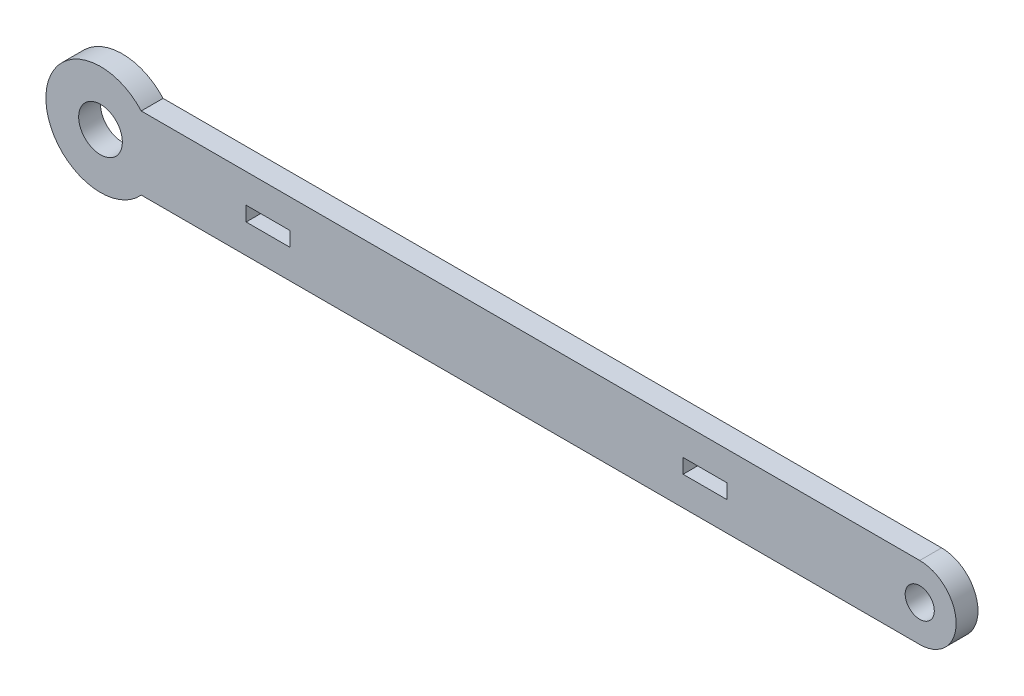
ISO-10303-21;
HEADER;
FILE_DESCRIPTION(('STEP AP214'),'2;1');
FILE_NAME('part.step','',(''),(''),'','','');
FILE_SCHEMA(('AUTOMOTIVE_DESIGN { 1 0 10303 214 1 1 1 1 }'));
ENDSEC;
DATA;
#1=APPLICATION_CONTEXT('core data for automotive mechanical design processes');
#2=APPLICATION_PROTOCOL_DEFINITION('international standard','automotive_design',2000,#1);
#3=PRODUCT_CONTEXT('',#1,'mechanical');
#4=PRODUCT('Part','Part','',(#3));
#5=PRODUCT_RELATED_PRODUCT_CATEGORY('part','',(#4));
#6=PRODUCT_DEFINITION_FORMATION('','',#4);
#7=PRODUCT_DEFINITION_CONTEXT('part definition',#1,'design');
#8=PRODUCT_DEFINITION('design','',#6,#7);
#9=PRODUCT_DEFINITION_SHAPE('','',#8);
#10=(LENGTH_UNIT() NAMED_UNIT(*) SI_UNIT(.MILLI.,.METRE.));
#11=(NAMED_UNIT(*) PLANE_ANGLE_UNIT() SI_UNIT($,.RADIAN.));
#12=(NAMED_UNIT(*) SI_UNIT($,.STERADIAN.) SOLID_ANGLE_UNIT());
#13=UNCERTAINTY_MEASURE_WITH_UNIT(LENGTH_MEASURE(1.E-05),#10,'distance_accuracy_value','');
#14=(GEOMETRIC_REPRESENTATION_CONTEXT(3) GLOBAL_UNCERTAINTY_ASSIGNED_CONTEXT((#13)) GLOBAL_UNIT_ASSIGNED_CONTEXT((#10,
#11,#12)) REPRESENTATION_CONTEXT('',''));
#15=CARTESIAN_POINT('',(0.,0.,0.));
#16=DIRECTION('',(0.,0.,1.));
#17=DIRECTION('',(1.,0.,0.));
#18=AXIS2_PLACEMENT_3D('',#15,#16,#17);
#19=CARTESIAN_POINT('',(0.,0.,1.5));
#20=DIRECTION('',(0.,0.,1.));
#21=DIRECTION('',(1.,0.,0.));
#22=AXIS2_PLACEMENT_3D('',#19,#20,#21);
#23=PLANE('',#22);
#24=CARTESIAN_POINT('',(112.5,0.,1.5));
#25=DIRECTION('',(0.,0.,1.));
#26=DIRECTION('',(1.,0.,0.));
#27=AXIS2_PLACEMENT_3D('',#24,#25,#26);
#28=CIRCLE('',#27,2.);
#29=CARTESIAN_POINT('',(114.5,0.,1.5));
#30=VERTEX_POINT('',#29);
#31=EDGE_CURVE('E165',#30,#30,#28,.T.);
#32=ORIENTED_EDGE('',*,*,#31,.F.);
#33=EDGE_LOOP('',(#32));
#34=FACE_BOUND('',#33,.T.);
#35=CARTESIAN_POINT('',(0.,0.,1.5));
#36=DIRECTION('',(0.,0.,1.));
#37=DIRECTION('',(1.,0.,0.));
#38=AXIS2_PLACEMENT_3D('',#35,#36,#37);
#39=CIRCLE('',#38,7.5);
#40=CARTESIAN_POINT('',(5.59016994374947,5.,1.5));
#41=VERTEX_POINT('',#40);
#42=CARTESIAN_POINT('',(5.59016994374947,-5.,1.5));
#43=VERTEX_POINT('',#42);
#44=EDGE_CURVE('E202',#41,#43,#39,.T.);
#45=ORIENTED_EDGE('',*,*,#44,.T.);
#46=DIRECTION('',(1.,0.,0.));
#47=VECTOR('',#46,1.);
#48=CARTESIAN_POINT('',(5.59016994374947,-5.,1.5));
#49=LINE('',#48,#47);
#50=CARTESIAN_POINT('',(112.5,-5.,1.5));
#51=VERTEX_POINT('',#50);
#52=EDGE_CURVE('E205',#43,#51,#49,.T.);
#53=ORIENTED_EDGE('',*,*,#52,.T.);
#54=CARTESIAN_POINT('',(112.5,0.,1.5));
#55=DIRECTION('',(0.,0.,1.));
#56=DIRECTION('',(1.,0.,0.));
#57=AXIS2_PLACEMENT_3D('',#54,#55,#56);
#58=CIRCLE('',#57,5.);
#59=CARTESIAN_POINT('',(112.5,5.,1.5));
#60=VERTEX_POINT('',#59);
#61=EDGE_CURVE('E208',#51,#60,#58,.T.);
#62=ORIENTED_EDGE('',*,*,#61,.T.);
#63=DIRECTION('',(-1.,0.,0.));
#64=VECTOR('',#63,1.);
#65=CARTESIAN_POINT('',(5.59016994374947,5.,1.5));
#66=LINE('',#65,#64);
#67=EDGE_CURVE('E210',#60,#41,#66,.T.);
#68=ORIENTED_EDGE('',*,*,#67,.T.);
#69=EDGE_LOOP('',(#45,#53,#62,#68));
#70=FACE_BOUND('',#69,.T.);
#71=DIRECTION('',(0.,-1.,0.));
#72=VECTOR('',#71,1.);
#73=CARTESIAN_POINT('',(20.,1.,1.5));
#74=LINE('',#73,#72);
#75=CARTESIAN_POINT('',(20.,1.,1.5));
#76=VERTEX_POINT('',#75);
#77=CARTESIAN_POINT('',(20.,-1.,1.5));
#78=VERTEX_POINT('',#77);
#79=EDGE_CURVE('E173',#76,#78,#74,.T.);
#80=ORIENTED_EDGE('',*,*,#79,.F.);
#81=DIRECTION('',(-1.,0.,0.));
#82=VECTOR('',#81,1.);
#83=CARTESIAN_POINT('',(26.,1.,1.5));
#84=LINE('',#83,#82);
#85=CARTESIAN_POINT('',(26.,1.,1.5));
#86=VERTEX_POINT('',#85);
#87=EDGE_CURVE('E171',#86,#76,#84,.T.);
#88=ORIENTED_EDGE('',*,*,#87,.F.);
#89=DIRECTION('',(0.,1.,0.));
#90=VECTOR('',#89,1.);
#91=CARTESIAN_POINT('',(26.,-1.,1.5));
#92=LINE('',#91,#90);
#93=CARTESIAN_POINT('',(26.,-1.,1.5));
#94=VERTEX_POINT('',#93);
#95=EDGE_CURVE('E179',#94,#86,#92,.T.);
#96=ORIENTED_EDGE('',*,*,#95,.F.);
#97=DIRECTION('',(1.,0.,0.));
#98=VECTOR('',#97,1.);
#99=CARTESIAN_POINT('',(20.,-1.,1.5));
#100=LINE('',#99,#98);
#101=EDGE_CURVE('E176',#78,#94,#100,.T.);
#102=ORIENTED_EDGE('',*,*,#101,.F.);
#103=EDGE_LOOP('',(#80,#88,#96,#102));
#104=FACE_BOUND('',#103,.T.);
#105=CARTESIAN_POINT('',(0.,0.,1.5));
#106=DIRECTION('',(0.,0.,1.));
#107=DIRECTION('',(1.,0.,0.));
#108=AXIS2_PLACEMENT_3D('',#105,#106,#107);
#109=CIRCLE('',#108,3.);
#110=CARTESIAN_POINT('',(3.,0.,1.5));
#111=VERTEX_POINT('',#110);
#112=EDGE_CURVE('E159',#111,#111,#109,.T.);
#113=ORIENTED_EDGE('',*,*,#112,.F.);
#114=EDGE_LOOP('',(#113));
#115=FACE_BOUND('',#114,.T.);
#116=DIRECTION('',(0.,-1.,0.));
#117=VECTOR('',#116,1.);
#118=CARTESIAN_POINT('',(80.,1.,1.5));
#119=LINE('',#118,#117);
#120=CARTESIAN_POINT('',(80.,1.,1.5));
#121=VERTEX_POINT('',#120);
#122=CARTESIAN_POINT('',(80.,-1.,1.5));
#123=VERTEX_POINT('',#122);
#124=EDGE_CURVE('E131',#121,#123,#119,.T.);
#125=ORIENTED_EDGE('',*,*,#124,.F.);
#126=DIRECTION('',(-1.,0.,0.));
#127=VECTOR('',#126,1.);
#128=CARTESIAN_POINT('',(86.,1.,1.5));
#129=LINE('',#128,#127);
#130=CARTESIAN_POINT('',(86.,1.,1.5));
#131=VERTEX_POINT('',#130);
#132=EDGE_CURVE('E123',#131,#121,#129,.T.);
#133=ORIENTED_EDGE('',*,*,#132,.F.);
#134=DIRECTION('',(0.,1.,0.));
#135=VECTOR('',#134,1.);
#136=CARTESIAN_POINT('',(86.,-1.,1.5));
#137=LINE('',#136,#135);
#138=CARTESIAN_POINT('',(86.,-1.,1.5));
#139=VERTEX_POINT('',#138);
#140=EDGE_CURVE('E145',#139,#131,#137,.T.);
#141=ORIENTED_EDGE('',*,*,#140,.F.);
#142=DIRECTION('',(1.,0.,0.));
#143=VECTOR('',#142,1.);
#144=CARTESIAN_POINT('',(80.,-1.,1.5));
#145=LINE('',#144,#143);
#146=EDGE_CURVE('E143',#123,#139,#145,.T.);
#147=ORIENTED_EDGE('',*,*,#146,.F.);
#148=EDGE_LOOP('',(#125,#133,#141,#147));
#149=FACE_BOUND('',#148,.T.);
#150=ADVANCED_FACE('F34',(#34,#70,#104,#115,#149),#23,.T.);
#151=CARTESIAN_POINT('',(0.,0.,-1.5));
#152=DIRECTION('',(0.,0.,1.));
#153=DIRECTION('',(1.,0.,0.));
#154=AXIS2_PLACEMENT_3D('',#151,#152,#153);
#155=PLANE('',#154);
#156=CARTESIAN_POINT('',(0.,0.,-1.5));
#157=DIRECTION('',(0.,0.,1.));
#158=DIRECTION('',(1.,0.,0.));
#159=AXIS2_PLACEMENT_3D('',#156,#157,#158);
#160=CIRCLE('',#159,3.);
#161=CARTESIAN_POINT('',(3.,0.,-1.5));
#162=VERTEX_POINT('',#161);
#163=EDGE_CURVE('E139',#162,#162,#160,.T.);
#164=ORIENTED_EDGE('',*,*,#163,.T.);
#165=EDGE_LOOP('',(#164));
#166=FACE_BOUND('',#165,.T.);
#167=CARTESIAN_POINT('',(112.5,0.,-1.5));
#168=DIRECTION('',(0.,0.,1.));
#169=DIRECTION('',(1.,0.,0.));
#170=AXIS2_PLACEMENT_3D('',#167,#168,#169);
#171=CIRCLE('',#170,2.);
#172=CARTESIAN_POINT('',(114.5,0.,-1.5));
#173=VERTEX_POINT('',#172);
#174=EDGE_CURVE('E162',#173,#173,#171,.T.);
#175=ORIENTED_EDGE('',*,*,#174,.T.);
#176=EDGE_LOOP('',(#175));
#177=FACE_BOUND('',#176,.T.);
#178=DIRECTION('',(-1.,0.,0.));
#179=VECTOR('',#178,1.);
#180=CARTESIAN_POINT('',(26.,1.,-1.5));
#181=LINE('',#180,#179);
#182=CARTESIAN_POINT('',(26.,1.,-1.5));
#183=VERTEX_POINT('',#182);
#184=CARTESIAN_POINT('',(20.,1.,-1.5));
#185=VERTEX_POINT('',#184);
#186=EDGE_CURVE('E168',#183,#185,#181,.T.);
#187=ORIENTED_EDGE('',*,*,#186,.T.);
#188=DIRECTION('',(0.,-1.,0.));
#189=VECTOR('',#188,1.);
#190=CARTESIAN_POINT('',(20.,1.,-1.5));
#191=LINE('',#190,#189);
#192=CARTESIAN_POINT('',(20.,-1.,-1.5));
#193=VERTEX_POINT('',#192);
#194=EDGE_CURVE('E184',#185,#193,#191,.T.);
#195=ORIENTED_EDGE('',*,*,#194,.T.);
#196=DIRECTION('',(1.,0.,0.));
#197=VECTOR('',#196,1.);
#198=CARTESIAN_POINT('',(20.,-1.,-1.5));
#199=LINE('',#198,#197);
#200=CARTESIAN_POINT('',(26.,-1.,-1.5));
#201=VERTEX_POINT('',#200);
#202=EDGE_CURVE('E187',#193,#201,#199,.T.);
#203=ORIENTED_EDGE('',*,*,#202,.T.);
#204=DIRECTION('',(0.,1.,0.));
#205=VECTOR('',#204,1.);
#206=CARTESIAN_POINT('',(26.,-1.,-1.5));
#207=LINE('',#206,#205);
#208=EDGE_CURVE('E174',#201,#183,#207,.T.);
#209=ORIENTED_EDGE('',*,*,#208,.T.);
#210=EDGE_LOOP('',(#187,#195,#203,#209));
#211=FACE_BOUND('',#210,.T.);
#212=CARTESIAN_POINT('',(0.,0.,-1.5));
#213=DIRECTION('',(0.,0.,1.));
#214=DIRECTION('',(1.,0.,0.));
#215=AXIS2_PLACEMENT_3D('',#212,#213,#214);
#216=CIRCLE('',#215,7.5);
#217=CARTESIAN_POINT('',(5.59016994374947,5.,-1.5));
#218=VERTEX_POINT('',#217);
#219=CARTESIAN_POINT('',(5.59016994374947,-5.,-1.5));
#220=VERTEX_POINT('',#219);
#221=EDGE_CURVE('E201',#218,#220,#216,.T.);
#222=ORIENTED_EDGE('',*,*,#221,.F.);
#223=DIRECTION('',(-1.,0.,0.));
#224=VECTOR('',#223,1.);
#225=CARTESIAN_POINT('',(5.59016994374947,5.,-1.5));
#226=LINE('',#225,#224);
#227=CARTESIAN_POINT('',(112.5,5.,-1.5));
#228=VERTEX_POINT('',#227);
#229=EDGE_CURVE('E206',#228,#218,#226,.T.);
#230=ORIENTED_EDGE('',*,*,#229,.F.);
#231=CARTESIAN_POINT('',(112.5,0.,-1.5));
#232=DIRECTION('',(0.,0.,1.));
#233=DIRECTION('',(1.,0.,0.));
#234=AXIS2_PLACEMENT_3D('',#231,#232,#233);
#235=CIRCLE('',#234,5.);
#236=CARTESIAN_POINT('',(112.5,-5.,-1.5));
#237=VERTEX_POINT('',#236);
#238=EDGE_CURVE('E217',#237,#228,#235,.T.);
#239=ORIENTED_EDGE('',*,*,#238,.F.);
#240=DIRECTION('',(1.,0.,0.));
#241=VECTOR('',#240,1.);
#242=CARTESIAN_POINT('',(5.59016994374947,-5.,-1.5));
#243=LINE('',#242,#241);
#244=EDGE_CURVE('E215',#220,#237,#243,.T.);
#245=ORIENTED_EDGE('',*,*,#244,.F.);
#246=EDGE_LOOP('',(#222,#230,#239,#245));
#247=FACE_BOUND('',#246,.T.);
#248=DIRECTION('',(-1.,0.,0.));
#249=VECTOR('',#248,1.);
#250=CARTESIAN_POINT('',(86.,1.,-1.5));
#251=LINE('',#250,#249);
#252=CARTESIAN_POINT('',(86.,1.,-1.5));
#253=VERTEX_POINT('',#252);
#254=CARTESIAN_POINT('',(80.,1.,-1.5));
#255=VERTEX_POINT('',#254);
#256=EDGE_CURVE('E57',#253,#255,#251,.T.);
#257=ORIENTED_EDGE('',*,*,#256,.T.);
#258=DIRECTION('',(0.,-1.,0.));
#259=VECTOR('',#258,1.);
#260=CARTESIAN_POINT('',(80.,1.,-1.5));
#261=LINE('',#260,#259);
#262=CARTESIAN_POINT('',(80.,-1.,-1.5));
#263=VERTEX_POINT('',#262);
#264=EDGE_CURVE('E138',#255,#263,#261,.T.);
#265=ORIENTED_EDGE('',*,*,#264,.T.);
#266=DIRECTION('',(1.,0.,0.));
#267=VECTOR('',#266,1.);
#268=CARTESIAN_POINT('',(80.,-1.,-1.5));
#269=LINE('',#268,#267);
#270=CARTESIAN_POINT('',(86.,-1.,-1.5));
#271=VERTEX_POINT('',#270);
#272=EDGE_CURVE('E151',#263,#271,#269,.T.);
#273=ORIENTED_EDGE('',*,*,#272,.T.);
#274=DIRECTION('',(0.,1.,0.));
#275=VECTOR('',#274,1.);
#276=CARTESIAN_POINT('',(86.,-1.,-1.5));
#277=LINE('',#276,#275);
#278=EDGE_CURVE('E132',#271,#253,#277,.T.);
#279=ORIENTED_EDGE('',*,*,#278,.T.);
#280=EDGE_LOOP('',(#257,#265,#273,#279));
#281=FACE_BOUND('',#280,.T.);
#282=ADVANCED_FACE('F235',(#166,#177,#211,#247,#281),#155,.F.);
#283=CARTESIAN_POINT('',(0.,0.,1.5));
#284=DIRECTION('',(0.,0.,-1.));
#285=DIRECTION('',(-1.,0.,0.));
#286=AXIS2_PLACEMENT_3D('',#283,#284,#285);
#287=CYLINDRICAL_SURFACE('',#286,7.5);
#288=ORIENTED_EDGE('',*,*,#221,.T.);
#289=DIRECTION('',(0.,0.,-1.));
#290=VECTOR('',#289,1.);
#291=CARTESIAN_POINT('',(5.59016994374947,-5.,1.5));
#292=LINE('',#291,#290);
#293=EDGE_CURVE('E11',#43,#220,#292,.T.);
#294=ORIENTED_EDGE('',*,*,#293,.F.);
#295=ORIENTED_EDGE('',*,*,#44,.F.);
#296=DIRECTION('',(0.,0.,-1.));
#297=VECTOR('',#296,1.);
#298=CARTESIAN_POINT('',(5.59016994374947,5.,1.5));
#299=LINE('',#298,#297);
#300=EDGE_CURVE('E212',#41,#218,#299,.T.);
#301=ORIENTED_EDGE('',*,*,#300,.T.);
#302=EDGE_LOOP('',(#288,#294,#295,#301));
#303=FACE_BOUND('',#302,.T.);
#304=ADVANCED_FACE('F36',(#303),#287,.T.);
#305=CARTESIAN_POINT('',(5.59016994374947,-5.,1.5));
#306=DIRECTION('',(0.,1.,0.));
#307=DIRECTION('',(0.,0.,1.));
#308=AXIS2_PLACEMENT_3D('',#305,#306,#307);
#309=PLANE('',#308);
#310=ORIENTED_EDGE('',*,*,#244,.T.);
#311=DIRECTION('',(0.,0.,-1.));
#312=VECTOR('',#311,1.);
#313=CARTESIAN_POINT('',(112.5,-5.,1.5));
#314=LINE('',#313,#312);
#315=EDGE_CURVE('E42',#51,#237,#314,.T.);
#316=ORIENTED_EDGE('',*,*,#315,.F.);
#317=ORIENTED_EDGE('',*,*,#52,.F.);
#318=ORIENTED_EDGE('',*,*,#293,.T.);
#319=EDGE_LOOP('',(#310,#316,#317,#318));
#320=FACE_BOUND('',#319,.T.);
#321=ADVANCED_FACE('F246',(#320),#309,.F.);
#322=CARTESIAN_POINT('',(112.5,0.,1.5));
#323=DIRECTION('',(0.,0.,-1.));
#324=DIRECTION('',(-1.,0.,0.));
#325=AXIS2_PLACEMENT_3D('',#322,#323,#324);
#326=CYLINDRICAL_SURFACE('',#325,5.);
#327=ORIENTED_EDGE('',*,*,#238,.T.);
#328=DIRECTION('',(0.,0.,-1.));
#329=VECTOR('',#328,1.);
#330=CARTESIAN_POINT('',(112.5,5.,1.5));
#331=LINE('',#330,#329);
#332=EDGE_CURVE('E222',#60,#228,#331,.T.);
#333=ORIENTED_EDGE('',*,*,#332,.F.);
#334=ORIENTED_EDGE('',*,*,#61,.F.);
#335=ORIENTED_EDGE('',*,*,#315,.T.);
#336=EDGE_LOOP('',(#327,#333,#334,#335));
#337=FACE_BOUND('',#336,.T.);
#338=ADVANCED_FACE('F229',(#337),#326,.T.);
#339=CARTESIAN_POINT('',(5.59016994374947,5.,1.5));
#340=DIRECTION('',(0.,-1.,0.));
#341=DIRECTION('',(0.,0.,-1.));
#342=AXIS2_PLACEMENT_3D('',#339,#340,#341);
#343=PLANE('',#342);
#344=ORIENTED_EDGE('',*,*,#229,.T.);
#345=ORIENTED_EDGE('',*,*,#300,.F.);
#346=ORIENTED_EDGE('',*,*,#67,.F.);
#347=ORIENTED_EDGE('',*,*,#332,.T.);
#348=EDGE_LOOP('',(#344,#345,#346,#347));
#349=FACE_BOUND('',#348,.T.);
#350=ADVANCED_FACE('F239',(#349),#343,.F.);
#351=CARTESIAN_POINT('',(26.,1.,1.5));
#352=DIRECTION('',(0.,-1.,0.));
#353=DIRECTION('',(1.,0.,0.));
#354=AXIS2_PLACEMENT_3D('',#351,#352,#353);
#355=PLANE('',#354);
#356=ORIENTED_EDGE('',*,*,#186,.F.);
#357=DIRECTION('',(0.,0.,-1.));
#358=VECTOR('',#357,1.);
#359=CARTESIAN_POINT('',(26.,1.,1.5));
#360=LINE('',#359,#358);
#361=EDGE_CURVE('E181',#86,#183,#360,.T.);
#362=ORIENTED_EDGE('',*,*,#361,.F.);
#363=ORIENTED_EDGE('',*,*,#87,.T.);
#364=DIRECTION('',(0.,0.,-1.));
#365=VECTOR('',#364,1.);
#366=CARTESIAN_POINT('',(20.,1.,1.5));
#367=LINE('',#366,#365);
#368=EDGE_CURVE('E198',#76,#185,#367,.T.);
#369=ORIENTED_EDGE('',*,*,#368,.T.);
#370=EDGE_LOOP('',(#356,#362,#363,#369));
#371=FACE_BOUND('',#370,.T.);
#372=ADVANCED_FACE('F263',(#371),#355,.T.);
#373=CARTESIAN_POINT('',(20.,1.,1.5));
#374=DIRECTION('',(1.,0.,0.));
#375=DIRECTION('',(0.,0.,-1.));
#376=AXIS2_PLACEMENT_3D('',#373,#374,#375);
#377=PLANE('',#376);
#378=ORIENTED_EDGE('',*,*,#194,.F.);
#379=ORIENTED_EDGE('',*,*,#368,.F.);
#380=ORIENTED_EDGE('',*,*,#79,.T.);
#381=DIRECTION('',(0.,0.,-1.));
#382=VECTOR('',#381,1.);
#383=CARTESIAN_POINT('',(20.,-1.,1.5));
#384=LINE('',#383,#382);
#385=EDGE_CURVE('E196',#78,#193,#384,.T.);
#386=ORIENTED_EDGE('',*,*,#385,.T.);
#387=EDGE_LOOP('',(#378,#379,#380,#386));
#388=FACE_BOUND('',#387,.T.);
#389=ADVANCED_FACE('F270',(#388),#377,.T.);
#390=CARTESIAN_POINT('',(20.,-1.,1.5));
#391=DIRECTION('',(0.,1.,0.));
#392=DIRECTION('',(0.,0.,1.));
#393=AXIS2_PLACEMENT_3D('',#390,#391,#392);
#394=PLANE('',#393);
#395=ORIENTED_EDGE('',*,*,#202,.F.);
#396=ORIENTED_EDGE('',*,*,#385,.F.);
#397=ORIENTED_EDGE('',*,*,#101,.T.);
#398=DIRECTION('',(0.,0.,-1.));
#399=VECTOR('',#398,1.);
#400=CARTESIAN_POINT('',(26.,-1.,1.5));
#401=LINE('',#400,#399);
#402=EDGE_CURVE('E194',#94,#201,#401,.T.);
#403=ORIENTED_EDGE('',*,*,#402,.T.);
#404=EDGE_LOOP('',(#395,#396,#397,#403));
#405=FACE_BOUND('',#404,.T.);
#406=ADVANCED_FACE('F275',(#405),#394,.T.);
#407=CARTESIAN_POINT('',(26.,-1.,1.5));
#408=DIRECTION('',(-1.,0.,0.));
#409=DIRECTION('',(0.,0.,1.));
#410=AXIS2_PLACEMENT_3D('',#407,#408,#409);
#411=PLANE('',#410);
#412=ORIENTED_EDGE('',*,*,#208,.F.);
#413=ORIENTED_EDGE('',*,*,#402,.F.);
#414=ORIENTED_EDGE('',*,*,#95,.T.);
#415=ORIENTED_EDGE('',*,*,#361,.T.);
#416=EDGE_LOOP('',(#412,#413,#414,#415));
#417=FACE_BOUND('',#416,.T.);
#418=ADVANCED_FACE('F283',(#417),#411,.T.);
#419=CARTESIAN_POINT('',(112.5,0.,1.5));
#420=DIRECTION('',(0.,0.,-1.));
#421=DIRECTION('',(-1.,0.,0.));
#422=AXIS2_PLACEMENT_3D('',#419,#420,#421);
#423=CYLINDRICAL_SURFACE('',#422,2.);
#424=ORIENTED_EDGE('',*,*,#31,.T.);
#425=EDGE_LOOP('',(#424));
#426=FACE_BOUND('',#425,.T.);
#427=ORIENTED_EDGE('',*,*,#174,.F.);
#428=EDGE_LOOP('',(#427));
#429=FACE_BOUND('',#428,.T.);
#430=ADVANCED_FACE('F296',(#426,#429),#423,.F.);
#431=CARTESIAN_POINT('',(0.,0.,1.5));
#432=DIRECTION('',(0.,0.,-1.));
#433=DIRECTION('',(-1.,0.,0.));
#434=AXIS2_PLACEMENT_3D('',#431,#432,#433);
#435=CYLINDRICAL_SURFACE('',#434,3.);
#436=ORIENTED_EDGE('',*,*,#112,.T.);
#437=EDGE_LOOP('',(#436));
#438=FACE_BOUND('',#437,.T.);
#439=ORIENTED_EDGE('',*,*,#163,.F.);
#440=EDGE_LOOP('',(#439));
#441=FACE_BOUND('',#440,.T.);
#442=ADVANCED_FACE('F293',(#438,#441),#435,.F.);
#443=CARTESIAN_POINT('',(86.,1.,1.5));
#444=DIRECTION('',(0.,-1.,0.));
#445=DIRECTION('',(1.,0.,0.));
#446=AXIS2_PLACEMENT_3D('',#443,#444,#445);
#447=PLANE('',#446);
#448=ORIENTED_EDGE('',*,*,#256,.F.);
#449=DIRECTION('',(0.,0.,-1.));
#450=VECTOR('',#449,1.);
#451=CARTESIAN_POINT('',(86.,1.,1.5));
#452=LINE('',#451,#450);
#453=EDGE_CURVE('E127',#131,#253,#452,.T.);
#454=ORIENTED_EDGE('',*,*,#453,.F.);
#455=ORIENTED_EDGE('',*,*,#132,.T.);
#456=DIRECTION('',(0.,0.,-1.));
#457=VECTOR('',#456,1.);
#458=CARTESIAN_POINT('',(80.,1.,1.5));
#459=LINE('',#458,#457);
#460=EDGE_CURVE('E126',#121,#255,#459,.T.);
#461=ORIENTED_EDGE('',*,*,#460,.T.);
#462=EDGE_LOOP('',(#448,#454,#455,#461));
#463=FACE_BOUND('',#462,.T.);
#464=ADVANCED_FACE('F125',(#463),#447,.T.);
#465=CARTESIAN_POINT('',(80.,1.,1.5));
#466=DIRECTION('',(1.,0.,0.));
#467=DIRECTION('',(0.,0.,-1.));
#468=AXIS2_PLACEMENT_3D('',#465,#466,#467);
#469=PLANE('',#468);
#470=ORIENTED_EDGE('',*,*,#264,.F.);
#471=ORIENTED_EDGE('',*,*,#460,.F.);
#472=ORIENTED_EDGE('',*,*,#124,.T.);
#473=DIRECTION('',(0.,0.,-1.));
#474=VECTOR('',#473,1.);
#475=CARTESIAN_POINT('',(80.,-1.,1.5));
#476=LINE('',#475,#474);
#477=EDGE_CURVE('E140',#123,#263,#476,.T.);
#478=ORIENTED_EDGE('',*,*,#477,.T.);
#479=EDGE_LOOP('',(#470,#471,#472,#478));
#480=FACE_BOUND('',#479,.T.);
#481=ADVANCED_FACE('F135',(#480),#469,.T.);
#482=CARTESIAN_POINT('',(80.,-1.,1.5));
#483=DIRECTION('',(0.,1.,0.));
#484=DIRECTION('',(0.,0.,1.));
#485=AXIS2_PLACEMENT_3D('',#482,#483,#484);
#486=PLANE('',#485);
#487=ORIENTED_EDGE('',*,*,#272,.F.);
#488=ORIENTED_EDGE('',*,*,#477,.F.);
#489=ORIENTED_EDGE('',*,*,#146,.T.);
#490=DIRECTION('',(0.,0.,-1.));
#491=VECTOR('',#490,1.);
#492=CARTESIAN_POINT('',(86.,-1.,1.5));
#493=LINE('',#492,#491);
#494=EDGE_CURVE('E49',#139,#271,#493,.T.);
#495=ORIENTED_EDGE('',*,*,#494,.T.);
#496=EDGE_LOOP('',(#487,#488,#489,#495));
#497=FACE_BOUND('',#496,.T.);
#498=ADVANCED_FACE('F346',(#497),#486,.T.);
#499=CARTESIAN_POINT('',(86.,-1.,1.5));
#500=DIRECTION('',(-1.,0.,0.));
#501=DIRECTION('',(0.,0.,1.));
#502=AXIS2_PLACEMENT_3D('',#499,#500,#501);
#503=PLANE('',#502);
#504=ORIENTED_EDGE('',*,*,#278,.F.);
#505=ORIENTED_EDGE('',*,*,#494,.F.);
#506=ORIENTED_EDGE('',*,*,#140,.T.);
#507=ORIENTED_EDGE('',*,*,#453,.T.);
#508=EDGE_LOOP('',(#504,#505,#506,#507));
#509=FACE_BOUND('',#508,.T.);
#510=ADVANCED_FACE('F355',(#509),#503,.T.);
#511=CLOSED_SHELL('',(#150,#282,#304,#321,#338,#350,#372,#389,#406,#418,#430,#442,#464,#481,
#498,#510));
#512=MANIFOLD_SOLID_BREP('B2',#511);
#513=ADVANCED_BREP_SHAPE_REPRESENTATION('',(#18,#512),#14);
#514=SHAPE_DEFINITION_REPRESENTATION(#9,#513);
ENDSEC;
END-ISO-10303-21;
